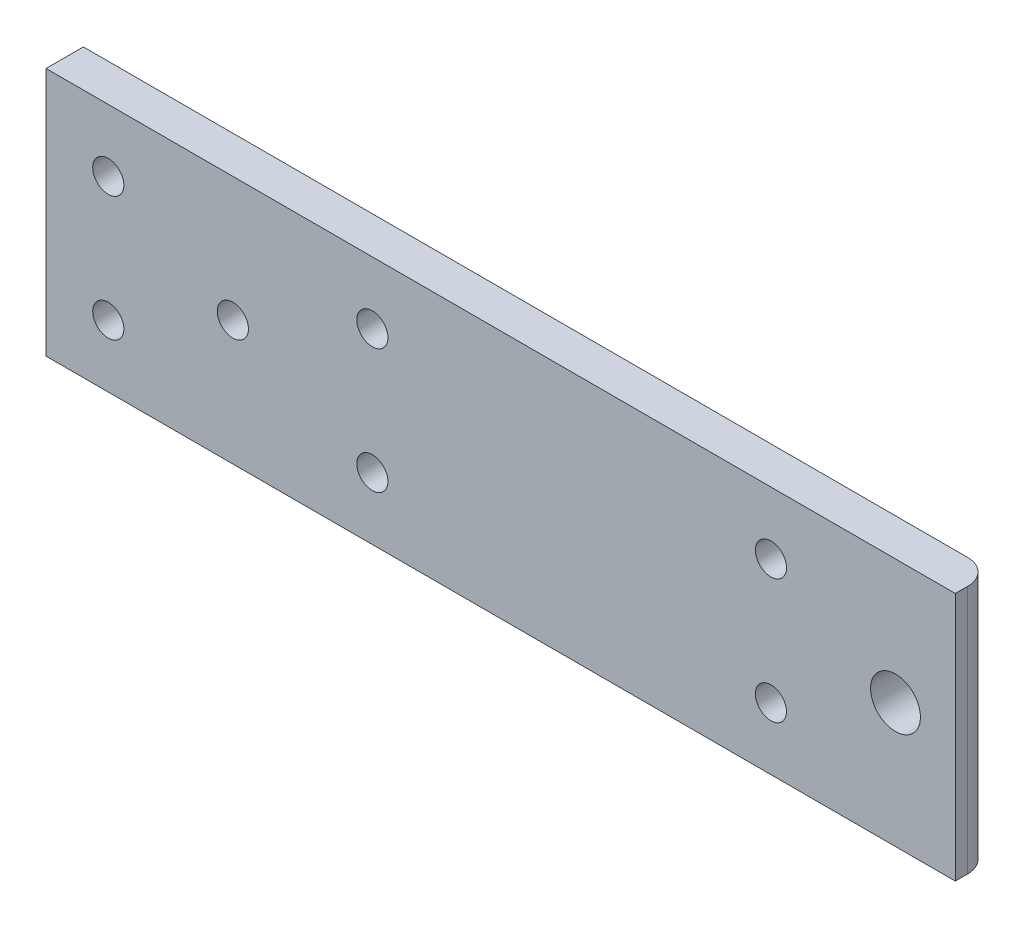
ISO-10303-21;
HEADER;
FILE_DESCRIPTION(('STEP AP214'),'2;1');
FILE_NAME('part.step','',(''),(''),'','','');
FILE_SCHEMA(('AUTOMOTIVE_DESIGN { 1 0 10303 214 1 1 1 1 }'));
ENDSEC;
DATA;
#1=APPLICATION_CONTEXT('core data for automotive mechanical design processes');
#2=APPLICATION_PROTOCOL_DEFINITION('international standard','automotive_design',2000,#1);
#3=PRODUCT_CONTEXT('',#1,'mechanical');
#4=PRODUCT('Part','Part','',(#3));
#5=PRODUCT_RELATED_PRODUCT_CATEGORY('part','',(#4));
#6=PRODUCT_DEFINITION_FORMATION('','',#4);
#7=PRODUCT_DEFINITION_CONTEXT('part definition',#1,'design');
#8=PRODUCT_DEFINITION('design','',#6,#7);
#9=PRODUCT_DEFINITION_SHAPE('','',#8);
#10=(LENGTH_UNIT() NAMED_UNIT(*) SI_UNIT(.MILLI.,.METRE.));
#11=(NAMED_UNIT(*) PLANE_ANGLE_UNIT() SI_UNIT($,.RADIAN.));
#12=(NAMED_UNIT(*) SI_UNIT($,.STERADIAN.) SOLID_ANGLE_UNIT());
#13=UNCERTAINTY_MEASURE_WITH_UNIT(LENGTH_MEASURE(1.E-05),#10,'distance_accuracy_value','');
#14=(GEOMETRIC_REPRESENTATION_CONTEXT(3) GLOBAL_UNCERTAINTY_ASSIGNED_CONTEXT((#13)) GLOBAL_UNIT_ASSIGNED_CONTEXT((#10,
#11,#12)) REPRESENTATION_CONTEXT('',''));
#15=CARTESIAN_POINT('',(0.,0.,0.));
#16=DIRECTION('',(0.,0.,1.));
#17=DIRECTION('',(1.,0.,0.));
#18=AXIS2_PLACEMENT_3D('',#15,#16,#17);
#19=CARTESIAN_POINT('',(241.310975887151,20.,15.155372436685));
#20=DIRECTION('',(0.,0.,1.));
#21=DIRECTION('',(1.,0.,0.));
#22=AXIS2_PLACEMENT_3D('',#19,#20,#21);
#23=PLANE('',#22);
#24=CARTESIAN_POINT('',(173.310975887151,5.00000000000826,15.155372436685));
#25=DIRECTION('',(0.,0.,1.));
#26=DIRECTION('',(1.,0.,0.));
#27=AXIS2_PLACEMENT_3D('',#24,#25,#26);
#28=CIRCLE('',#27,1.25000000000001);
#29=CARTESIAN_POINT('',(174.560975887151,5.00000000000826,15.155372436685));
#30=VERTEX_POINT('',#29);
#31=EDGE_CURVE('E201',#30,#30,#28,.T.);
#32=ORIENTED_EDGE('',*,*,#31,.F.);
#33=EDGE_LOOP('',(#32));
#34=FACE_BOUND('',#33,.T.);
#35=CARTESIAN_POINT('',(173.310975887151,14.9999999999917,15.155372436685));
#36=DIRECTION('',(0.,0.,1.));
#37=DIRECTION('',(1.,0.,0.));
#38=AXIS2_PLACEMENT_3D('',#35,#36,#37);
#39=CIRCLE('',#38,1.25000000000001);
#40=CARTESIAN_POINT('',(174.560975887151,14.9999999999917,15.155372436685));
#41=VERTEX_POINT('',#40);
#42=EDGE_CURVE('E196',#41,#41,#39,.T.);
#43=ORIENTED_EDGE('',*,*,#42,.F.);
#44=EDGE_LOOP('',(#43));
#45=FACE_BOUND('',#44,.T.);
#46=CARTESIAN_POINT('',(194.510975887151,5.00000000000825,15.155372436685));
#47=DIRECTION('',(0.,0.,1.));
#48=DIRECTION('',(1.,0.,0.));
#49=AXIS2_PLACEMENT_3D('',#46,#47,#48);
#50=CIRCLE('',#49,1.25000000000001);
#51=CARTESIAN_POINT('',(195.760975887151,5.00000000000825,15.155372436685));
#52=VERTEX_POINT('',#51);
#53=EDGE_CURVE('E224',#52,#52,#50,.F.);
#54=ORIENTED_EDGE('',*,*,#53,.T.);
#55=EDGE_LOOP('',(#54));
#56=FACE_BOUND('',#55,.T.);
#57=CARTESIAN_POINT('',(236.510975887151,9.99999999999999,15.155372436685));
#58=DIRECTION('',(0.,0.,1.));
#59=DIRECTION('',(1.,0.,0.));
#60=AXIS2_PLACEMENT_3D('',#57,#58,#59);
#61=CIRCLE('',#60,2.);
#62=CARTESIAN_POINT('',(238.510975887151,9.99999999999999,15.155372436685));
#63=VERTEX_POINT('',#62);
#64=EDGE_CURVE('E230',#63,#63,#61,.T.);
#65=ORIENTED_EDGE('',*,*,#64,.F.);
#66=EDGE_LOOP('',(#65));
#67=FACE_BOUND('',#66,.T.);
#68=CARTESIAN_POINT('',(194.510975887151,14.9999999999918,15.155372436685));
#69=DIRECTION('',(0.,0.,1.));
#70=DIRECTION('',(1.,0.,0.));
#71=AXIS2_PLACEMENT_3D('',#68,#69,#70);
#72=CIRCLE('',#71,1.25000000000001);
#73=CARTESIAN_POINT('',(195.760975887151,14.9999999999918,15.155372436685));
#74=VERTEX_POINT('',#73);
#75=EDGE_CURVE('E236',#74,#74,#72,.T.);
#76=ORIENTED_EDGE('',*,*,#75,.F.);
#77=EDGE_LOOP('',(#76));
#78=FACE_BOUND('',#77,.T.);
#79=CARTESIAN_POINT('',(183.310975887151,10.,15.155372436685));
#80=DIRECTION('',(0.,0.,1.));
#81=DIRECTION('',(1.,0.,0.));
#82=AXIS2_PLACEMENT_3D('',#79,#80,#81);
#83=CIRCLE('',#82,1.25000000000001);
#84=CARTESIAN_POINT('',(184.560975887151,10.,15.155372436685));
#85=VERTEX_POINT('',#84);
#86=EDGE_CURVE('E115',#85,#85,#83,.T.);
#87=ORIENTED_EDGE('',*,*,#86,.F.);
#88=EDGE_LOOP('',(#87));
#89=FACE_BOUND('',#88,.T.);
#90=DIRECTION('',(-1.,0.,0.));
#91=VECTOR('',#90,1.);
#92=CARTESIAN_POINT('',(241.310975887151,0.,15.155372436685));
#93=LINE('',#92,#91);
#94=CARTESIAN_POINT('',(241.310975887151,0.,15.155372436685));
#95=VERTEX_POINT('',#94);
#96=CARTESIAN_POINT('',(168.310975887151,0.,15.155372436685));
#97=VERTEX_POINT('',#96);
#98=EDGE_CURVE('E114',#95,#97,#93,.T.);
#99=ORIENTED_EDGE('',*,*,#98,.F.);
#100=DIRECTION('',(0.,-1.,0.));
#101=VECTOR('',#100,1.);
#102=CARTESIAN_POINT('',(241.310975887151,20.,15.155372436685));
#103=LINE('',#102,#101);
#104=CARTESIAN_POINT('',(241.310975887151,20.,15.155372436685));
#105=VERTEX_POINT('',#104);
#106=EDGE_CURVE('E101',#105,#95,#103,.T.);
#107=ORIENTED_EDGE('',*,*,#106,.F.);
#108=DIRECTION('',(-1.,0.,0.));
#109=VECTOR('',#108,1.);
#110=CARTESIAN_POINT('',(241.310975887151,20.,15.155372436685));
#111=LINE('',#110,#109);
#112=CARTESIAN_POINT('',(168.310975887151,20.,15.155372436685));
#113=VERTEX_POINT('',#112);
#114=EDGE_CURVE('E86',#105,#113,#111,.T.);
#115=ORIENTED_EDGE('',*,*,#114,.T.);
#116=DIRECTION('',(0.,-1.,0.));
#117=VECTOR('',#116,1.);
#118=CARTESIAN_POINT('',(168.310975887151,20.,15.155372436685));
#119=LINE('',#118,#117);
#120=EDGE_CURVE('E93',#113,#97,#119,.T.);
#121=ORIENTED_EDGE('',*,*,#120,.T.);
#122=EDGE_LOOP('',(#99,#107,#115,#121));
#123=FACE_BOUND('',#122,.T.);
#124=CARTESIAN_POINT('',(226.510975887151,14.9999999999918,15.155372436685));
#125=DIRECTION('',(0.,0.,1.));
#126=DIRECTION('',(1.,0.,0.));
#127=AXIS2_PLACEMENT_3D('',#124,#125,#126);
#128=CIRCLE('',#127,1.25000000000001);
#129=CARTESIAN_POINT('',(227.760975887151,14.9999999999918,15.155372436685));
#130=VERTEX_POINT('',#129);
#131=EDGE_CURVE('E218',#130,#130,#128,.T.);
#132=ORIENTED_EDGE('',*,*,#131,.F.);
#133=EDGE_LOOP('',(#132));
#134=FACE_BOUND('',#133,.T.);
#135=CARTESIAN_POINT('',(226.510975887151,5.00000000000823,15.155372436685));
#136=DIRECTION('',(0.,0.,1.));
#137=DIRECTION('',(1.,0.,0.));
#138=AXIS2_PLACEMENT_3D('',#135,#136,#137);
#139=CIRCLE('',#138,1.25000000000001);
#140=CARTESIAN_POINT('',(227.760975887151,5.00000000000823,15.155372436685));
#141=VERTEX_POINT('',#140);
#142=EDGE_CURVE('E212',#141,#141,#139,.F.);
#143=ORIENTED_EDGE('',*,*,#142,.T.);
#144=EDGE_LOOP('',(#143));
#145=FACE_BOUND('',#144,.T.);
#146=ADVANCED_FACE('F36',(#34,#45,#56,#67,#78,#89,#123,#134,#145),#23,.T.);
#147=CARTESIAN_POINT('',(168.310975887151,20.,12.155372436685));
#148=DIRECTION('',(0.,0.,-1.));
#149=DIRECTION('',(-1.,0.,0.));
#150=AXIS2_PLACEMENT_3D('',#147,#148,#149);
#151=PLANE('',#150);
#152=CARTESIAN_POINT('',(173.310975887151,5.00000000000826,12.155372436685));
#153=DIRECTION('',(0.,0.,-1.));
#154=DIRECTION('',(-1.,0.,0.));
#155=AXIS2_PLACEMENT_3D('',#152,#153,#154);
#156=CIRCLE('',#155,1.25000000000001);
#157=CARTESIAN_POINT('',(172.060975887151,5.00000000000826,12.155372436685));
#158=VERTEX_POINT('',#157);
#159=EDGE_CURVE('E206',#158,#158,#156,.T.);
#160=ORIENTED_EDGE('',*,*,#159,.F.);
#161=EDGE_LOOP('',(#160));
#162=FACE_BOUND('',#161,.T.);
#163=CARTESIAN_POINT('',(173.310975887151,14.9999999999917,12.155372436685));
#164=DIRECTION('',(0.,0.,-1.));
#165=DIRECTION('',(-1.,0.,0.));
#166=AXIS2_PLACEMENT_3D('',#163,#164,#165);
#167=CIRCLE('',#166,1.25000000000001);
#168=CARTESIAN_POINT('',(172.060975887151,14.9999999999917,12.155372436685));
#169=VERTEX_POINT('',#168);
#170=EDGE_CURVE('E199',#169,#169,#167,.T.);
#171=ORIENTED_EDGE('',*,*,#170,.F.);
#172=EDGE_LOOP('',(#171));
#173=FACE_BOUND('',#172,.T.);
#174=CARTESIAN_POINT('',(194.510975887151,5.00000000000825,12.155372436685));
#175=DIRECTION('',(0.,0.,1.));
#176=DIRECTION('',(1.,0.,0.));
#177=AXIS2_PLACEMENT_3D('',#174,#175,#176);
#178=CIRCLE('',#177,1.25000000000001);
#179=CARTESIAN_POINT('',(195.760975887151,5.00000000000825,12.155372436685));
#180=VERTEX_POINT('',#179);
#181=EDGE_CURVE('E221',#180,#180,#178,.T.);
#182=ORIENTED_EDGE('',*,*,#181,.T.);
#183=EDGE_LOOP('',(#182));
#184=FACE_BOUND('',#183,.T.);
#185=CARTESIAN_POINT('',(236.510975887151,9.99999999999999,12.155372436685));
#186=DIRECTION('',(0.,0.,-1.));
#187=DIRECTION('',(-1.,0.,0.));
#188=AXIS2_PLACEMENT_3D('',#185,#186,#187);
#189=CIRCLE('',#188,2.);
#190=CARTESIAN_POINT('',(234.510975887151,9.99999999999999,12.155372436685));
#191=VERTEX_POINT('',#190);
#192=EDGE_CURVE('E227',#191,#191,#189,.T.);
#193=ORIENTED_EDGE('',*,*,#192,.F.);
#194=EDGE_LOOP('',(#193));
#195=FACE_BOUND('',#194,.T.);
#196=CARTESIAN_POINT('',(194.510975887151,14.9999999999918,12.155372436685));
#197=DIRECTION('',(0.,0.,-1.));
#198=DIRECTION('',(-1.,0.,0.));
#199=AXIS2_PLACEMENT_3D('',#196,#197,#198);
#200=CIRCLE('',#199,1.25000000000001);
#201=CARTESIAN_POINT('',(193.260975887151,14.9999999999918,12.155372436685));
#202=VERTEX_POINT('',#201);
#203=EDGE_CURVE('E233',#202,#202,#200,.T.);
#204=ORIENTED_EDGE('',*,*,#203,.F.);
#205=EDGE_LOOP('',(#204));
#206=FACE_BOUND('',#205,.T.);
#207=CARTESIAN_POINT('',(183.310975887151,10.,12.155372436685));
#208=DIRECTION('',(0.,0.,-1.));
#209=DIRECTION('',(-1.,0.,0.));
#210=AXIS2_PLACEMENT_3D('',#207,#208,#209);
#211=CIRCLE('',#210,1.25000000000001);
#212=CARTESIAN_POINT('',(182.060975887151,10.,12.155372436685));
#213=VERTEX_POINT('',#212);
#214=EDGE_CURVE('E239',#213,#213,#211,.T.);
#215=ORIENTED_EDGE('',*,*,#214,.F.);
#216=EDGE_LOOP('',(#215));
#217=FACE_BOUND('',#216,.T.);
#218=DIRECTION('',(1.,0.,0.));
#219=VECTOR('',#218,1.);
#220=CARTESIAN_POINT('',(168.310975887151,20.,12.155372436685));
#221=LINE('',#220,#219);
#222=CARTESIAN_POINT('',(168.310975887151,20.,12.155372436685));
#223=VERTEX_POINT('',#222);
#224=CARTESIAN_POINT('',(239.310975887151,20.,12.155372436685));
#225=VERTEX_POINT('',#224);
#226=EDGE_CURVE('E88',#223,#225,#221,.T.);
#227=ORIENTED_EDGE('',*,*,#226,.T.);
#228=DIRECTION('',(0.,-1.,0.));
#229=VECTOR('',#228,1.);
#230=CARTESIAN_POINT('',(239.310975887151,20.,12.155372436685));
#231=LINE('',#230,#229);
#232=CARTESIAN_POINT('',(239.310975887151,0.,12.155372436685));
#233=VERTEX_POINT('',#232);
#234=EDGE_CURVE('E100',#225,#233,#231,.T.);
#235=ORIENTED_EDGE('',*,*,#234,.T.);
#236=DIRECTION('',(1.,0.,0.));
#237=VECTOR('',#236,1.);
#238=CARTESIAN_POINT('',(168.310975887151,0.,12.155372436685));
#239=LINE('',#238,#237);
#240=CARTESIAN_POINT('',(168.310975887151,0.,12.155372436685));
#241=VERTEX_POINT('',#240);
#242=EDGE_CURVE('E90',#241,#233,#239,.T.);
#243=ORIENTED_EDGE('',*,*,#242,.F.);
#244=DIRECTION('',(0.,-1.,0.));
#245=VECTOR('',#244,1.);
#246=CARTESIAN_POINT('',(168.310975887151,20.,12.155372436685));
#247=LINE('',#246,#245);
#248=EDGE_CURVE('E112',#223,#241,#247,.T.);
#249=ORIENTED_EDGE('',*,*,#248,.F.);
#250=EDGE_LOOP('',(#227,#235,#243,#249));
#251=FACE_BOUND('',#250,.T.);
#252=CARTESIAN_POINT('',(226.510975887151,14.9999999999918,12.155372436685));
#253=DIRECTION('',(0.,0.,-1.));
#254=DIRECTION('',(-1.,0.,0.));
#255=AXIS2_PLACEMENT_3D('',#252,#253,#254);
#256=CIRCLE('',#255,1.25000000000001);
#257=CARTESIAN_POINT('',(225.260975887151,14.9999999999918,12.155372436685));
#258=VERTEX_POINT('',#257);
#259=EDGE_CURVE('E215',#258,#258,#256,.T.);
#260=ORIENTED_EDGE('',*,*,#259,.F.);
#261=EDGE_LOOP('',(#260));
#262=FACE_BOUND('',#261,.T.);
#263=CARTESIAN_POINT('',(226.510975887151,5.00000000000823,12.155372436685));
#264=DIRECTION('',(0.,0.,1.));
#265=DIRECTION('',(1.,0.,0.));
#266=AXIS2_PLACEMENT_3D('',#263,#264,#265);
#267=CIRCLE('',#266,1.25000000000001);
#268=CARTESIAN_POINT('',(227.760975887151,5.00000000000823,12.155372436685));
#269=VERTEX_POINT('',#268);
#270=EDGE_CURVE('E203',#269,#269,#267,.T.);
#271=ORIENTED_EDGE('',*,*,#270,.T.);
#272=EDGE_LOOP('',(#271));
#273=FACE_BOUND('',#272,.T.);
#274=ADVANCED_FACE('F127',(#162,#173,#184,#195,#206,#217,#251,#262,#273),#151,.T.);
#275=CARTESIAN_POINT('',(168.310975887151,20.,12.155372436685));
#276=DIRECTION('',(1.,0.,0.));
#277=DIRECTION('',(0.,0.,-1.));
#278=AXIS2_PLACEMENT_3D('',#275,#276,#277);
#279=PLANE('',#278);
#280=DIRECTION('',(0.,0.,1.));
#281=VECTOR('',#280,1.);
#282=CARTESIAN_POINT('',(168.310975887151,0.,12.155372436685));
#283=LINE('',#282,#281);
#284=EDGE_CURVE('E96',#241,#97,#283,.T.);
#285=ORIENTED_EDGE('',*,*,#284,.T.);
#286=ORIENTED_EDGE('',*,*,#120,.F.);
#287=DIRECTION('',(0.,0.,1.));
#288=VECTOR('',#287,1.);
#289=CARTESIAN_POINT('',(168.310975887151,20.,12.155372436685));
#290=LINE('',#289,#288);
#291=EDGE_CURVE('E82',#223,#113,#290,.T.);
#292=ORIENTED_EDGE('',*,*,#291,.F.);
#293=ORIENTED_EDGE('',*,*,#248,.T.);
#294=EDGE_LOOP('',(#285,#286,#292,#293));
#295=FACE_BOUND('',#294,.T.);
#296=ADVANCED_FACE('F94',(#295),#279,.F.);
#297=CARTESIAN_POINT('',(241.310975887151,20.,12.155372436685));
#298=DIRECTION('',(1.,0.,0.));
#299=DIRECTION('',(0.,0.,-1.));
#300=AXIS2_PLACEMENT_3D('',#297,#298,#299);
#301=PLANE('',#300);
#302=DIRECTION('',(0.,0.,1.));
#303=VECTOR('',#302,1.);
#304=CARTESIAN_POINT('',(241.310975887151,0.,12.155372436685));
#305=LINE('',#304,#303);
#306=CARTESIAN_POINT('',(241.310975887151,0.,14.155372436685));
#307=VERTEX_POINT('',#306);
#308=EDGE_CURVE('E117',#307,#95,#305,.T.);
#309=ORIENTED_EDGE('',*,*,#308,.F.);
#310=DIRECTION('',(0.,-1.,0.));
#311=VECTOR('',#310,1.);
#312=CARTESIAN_POINT('',(241.310975887151,20.,14.155372436685));
#313=LINE('',#312,#311);
#314=CARTESIAN_POINT('',(241.310975887151,20.,14.155372436685));
#315=VERTEX_POINT('',#314);
#316=EDGE_CURVE('E44',#307,#315,#313,.F.);
#317=ORIENTED_EDGE('',*,*,#316,.T.);
#318=DIRECTION('',(0.,0.,1.));
#319=VECTOR('',#318,1.);
#320=CARTESIAN_POINT('',(241.310975887151,20.,12.155372436685));
#321=LINE('',#320,#319);
#322=EDGE_CURVE('E106',#315,#105,#321,.T.);
#323=ORIENTED_EDGE('',*,*,#322,.T.);
#324=ORIENTED_EDGE('',*,*,#106,.T.);
#325=EDGE_LOOP('',(#309,#317,#323,#324));
#326=FACE_BOUND('',#325,.T.);
#327=ADVANCED_FACE('F132',(#326),#301,.T.);
#328=CARTESIAN_POINT('',(0.,20.,0.));
#329=DIRECTION('',(0.,-1.,0.));
#330=DIRECTION('',(0.,0.,-1.));
#331=AXIS2_PLACEMENT_3D('',#328,#329,#330);
#332=PLANE('',#331);
#333=ORIENTED_EDGE('',*,*,#322,.F.);
#334=CARTESIAN_POINT('',(239.310975887151,20.,14.155372436685));
#335=DIRECTION('',(0.,-1.,0.));
#336=DIRECTION('',(0.,0.,-1.));
#337=AXIS2_PLACEMENT_3D('',#334,#335,#336);
#338=CIRCLE('',#337,2.);
#339=EDGE_CURVE('E11',#315,#225,#338,.F.);
#340=ORIENTED_EDGE('',*,*,#339,.T.);
#341=ORIENTED_EDGE('',*,*,#226,.F.);
#342=ORIENTED_EDGE('',*,*,#291,.T.);
#343=ORIENTED_EDGE('',*,*,#114,.F.);
#344=EDGE_LOOP('',(#333,#340,#341,#342,#343));
#345=FACE_BOUND('',#344,.T.);
#346=ADVANCED_FACE('F84',(#345),#332,.F.);
#347=CARTESIAN_POINT('',(0.,0.,0.));
#348=DIRECTION('',(0.,-1.,0.));
#349=DIRECTION('',(0.,0.,-1.));
#350=AXIS2_PLACEMENT_3D('',#347,#348,#349);
#351=PLANE('',#350);
#352=ORIENTED_EDGE('',*,*,#242,.T.);
#353=CARTESIAN_POINT('',(239.310975887151,0.,14.155372436685));
#354=DIRECTION('',(0.,-1.,0.));
#355=DIRECTION('',(0.,0.,-1.));
#356=AXIS2_PLACEMENT_3D('',#353,#354,#355);
#357=CIRCLE('',#356,2.);
#358=EDGE_CURVE('E58',#233,#307,#357,.T.);
#359=ORIENTED_EDGE('',*,*,#358,.T.);
#360=ORIENTED_EDGE('',*,*,#308,.T.);
#361=ORIENTED_EDGE('',*,*,#98,.T.);
#362=ORIENTED_EDGE('',*,*,#284,.F.);
#363=EDGE_LOOP('',(#352,#359,#360,#361,#362));
#364=FACE_BOUND('',#363,.T.);
#365=ADVANCED_FACE('F131',(#364),#351,.T.);
#366=CARTESIAN_POINT('',(183.310975887151,10.,32.155372436685));
#367=DIRECTION('',(0.,0.,-1.));
#368=DIRECTION('',(-1.,0.,0.));
#369=AXIS2_PLACEMENT_3D('',#366,#367,#368);
#370=CYLINDRICAL_SURFACE('',#369,1.25000000000001);
#371=ORIENTED_EDGE('',*,*,#86,.T.);
#372=EDGE_LOOP('',(#371));
#373=FACE_BOUND('',#372,.T.);
#374=ORIENTED_EDGE('',*,*,#214,.T.);
#375=EDGE_LOOP('',(#374));
#376=FACE_BOUND('',#375,.T.);
#377=ADVANCED_FACE('F163',(#373,#376),#370,.F.);
#378=CARTESIAN_POINT('',(194.510975887151,14.9999999999918,32.155372436685));
#379=DIRECTION('',(0.,0.,-1.));
#380=DIRECTION('',(-1.,0.,0.));
#381=AXIS2_PLACEMENT_3D('',#378,#379,#380);
#382=CYLINDRICAL_SURFACE('',#381,1.25000000000001);
#383=ORIENTED_EDGE('',*,*,#75,.T.);
#384=EDGE_LOOP('',(#383));
#385=FACE_BOUND('',#384,.T.);
#386=ORIENTED_EDGE('',*,*,#203,.T.);
#387=EDGE_LOOP('',(#386));
#388=FACE_BOUND('',#387,.T.);
#389=ADVANCED_FACE('F168',(#385,#388),#382,.F.);
#390=CARTESIAN_POINT('',(236.510975887151,9.99999999999999,32.155372436685));
#391=DIRECTION('',(0.,0.,-1.));
#392=DIRECTION('',(-1.,0.,0.));
#393=AXIS2_PLACEMENT_3D('',#390,#391,#392);
#394=CYLINDRICAL_SURFACE('',#393,2.);
#395=ORIENTED_EDGE('',*,*,#64,.T.);
#396=EDGE_LOOP('',(#395));
#397=FACE_BOUND('',#396,.T.);
#398=ORIENTED_EDGE('',*,*,#192,.T.);
#399=EDGE_LOOP('',(#398));
#400=FACE_BOUND('',#399,.T.);
#401=ADVANCED_FACE('F172',(#397,#400),#394,.F.);
#402=CARTESIAN_POINT('',(194.510975887151,5.00000000000825,32.155372436685));
#403=DIRECTION('',(0.,0.,-1.));
#404=DIRECTION('',(-1.,0.,0.));
#405=AXIS2_PLACEMENT_3D('',#402,#403,#404);
#406=CYLINDRICAL_SURFACE('',#405,1.25000000000001);
#407=ORIENTED_EDGE('',*,*,#53,.F.);
#408=EDGE_LOOP('',(#407));
#409=FACE_BOUND('',#408,.T.);
#410=ORIENTED_EDGE('',*,*,#181,.F.);
#411=EDGE_LOOP('',(#410));
#412=FACE_BOUND('',#411,.T.);
#413=ADVANCED_FACE('F176',(#409,#412),#406,.F.);
#414=CARTESIAN_POINT('',(226.510975887151,14.9999999999918,32.155372436685));
#415=DIRECTION('',(0.,0.,-1.));
#416=DIRECTION('',(-1.,0.,0.));
#417=AXIS2_PLACEMENT_3D('',#414,#415,#416);
#418=CYLINDRICAL_SURFACE('',#417,1.25000000000001);
#419=ORIENTED_EDGE('',*,*,#131,.T.);
#420=EDGE_LOOP('',(#419));
#421=FACE_BOUND('',#420,.T.);
#422=ORIENTED_EDGE('',*,*,#259,.T.);
#423=EDGE_LOOP('',(#422));
#424=FACE_BOUND('',#423,.T.);
#425=ADVANCED_FACE('F180',(#421,#424),#418,.F.);
#426=CARTESIAN_POINT('',(226.510975887151,5.00000000000823,32.155372436685));
#427=DIRECTION('',(0.,0.,-1.));
#428=DIRECTION('',(-1.,0.,0.));
#429=AXIS2_PLACEMENT_3D('',#426,#427,#428);
#430=CYLINDRICAL_SURFACE('',#429,1.25000000000001);
#431=ORIENTED_EDGE('',*,*,#142,.F.);
#432=EDGE_LOOP('',(#431));
#433=FACE_BOUND('',#432,.T.);
#434=ORIENTED_EDGE('',*,*,#270,.F.);
#435=EDGE_LOOP('',(#434));
#436=FACE_BOUND('',#435,.T.);
#437=ADVANCED_FACE('F184',(#433,#436),#430,.F.);
#438=CARTESIAN_POINT('',(173.310975887151,14.9999999999917,32.155372436685));
#439=DIRECTION('',(0.,0.,-1.));
#440=DIRECTION('',(-1.,0.,0.));
#441=AXIS2_PLACEMENT_3D('',#438,#439,#440);
#442=CYLINDRICAL_SURFACE('',#441,1.25000000000001);
#443=ORIENTED_EDGE('',*,*,#42,.T.);
#444=EDGE_LOOP('',(#443));
#445=FACE_BOUND('',#444,.T.);
#446=ORIENTED_EDGE('',*,*,#170,.T.);
#447=EDGE_LOOP('',(#446));
#448=FACE_BOUND('',#447,.T.);
#449=ADVANCED_FACE('F138',(#445,#448),#442,.F.);
#450=CARTESIAN_POINT('',(173.310975887151,5.00000000000826,32.155372436685));
#451=DIRECTION('',(0.,0.,-1.));
#452=DIRECTION('',(-1.,0.,0.));
#453=AXIS2_PLACEMENT_3D('',#450,#451,#452);
#454=CYLINDRICAL_SURFACE('',#453,1.25000000000001);
#455=ORIENTED_EDGE('',*,*,#31,.T.);
#456=EDGE_LOOP('',(#455));
#457=FACE_BOUND('',#456,.T.);
#458=ORIENTED_EDGE('',*,*,#159,.T.);
#459=EDGE_LOOP('',(#458));
#460=FACE_BOUND('',#459,.T.);
#461=ADVANCED_FACE('F134',(#457,#460),#454,.F.);
#462=CARTESIAN_POINT('',(239.310975887151,20.,14.155372436685));
#463=DIRECTION('',(0.,-1.,0.));
#464=DIRECTION('',(0.,0.,-1.));
#465=AXIS2_PLACEMENT_3D('',#462,#463,#464);
#466=CYLINDRICAL_SURFACE('',#465,2.);
#467=ORIENTED_EDGE('',*,*,#339,.F.);
#468=ORIENTED_EDGE('',*,*,#316,.F.);
#469=ORIENTED_EDGE('',*,*,#358,.F.);
#470=ORIENTED_EDGE('',*,*,#234,.F.);
#471=EDGE_LOOP('',(#467,#468,#469,#470));
#472=FACE_BOUND('',#471,.T.);
#473=ADVANCED_FACE('F38',(#472),#466,.T.);
#474=CLOSED_SHELL('',(#146,#274,#296,#327,#346,#365,#377,#389,#401,#413,#425,#437,#449,#461,#473));
#475=MANIFOLD_SOLID_BREP('B2',#474);
#476=ADVANCED_BREP_SHAPE_REPRESENTATION('',(#18,#475),#14);
#477=SHAPE_DEFINITION_REPRESENTATION(#9,#476);
ENDSEC;
END-ISO-10303-21;
